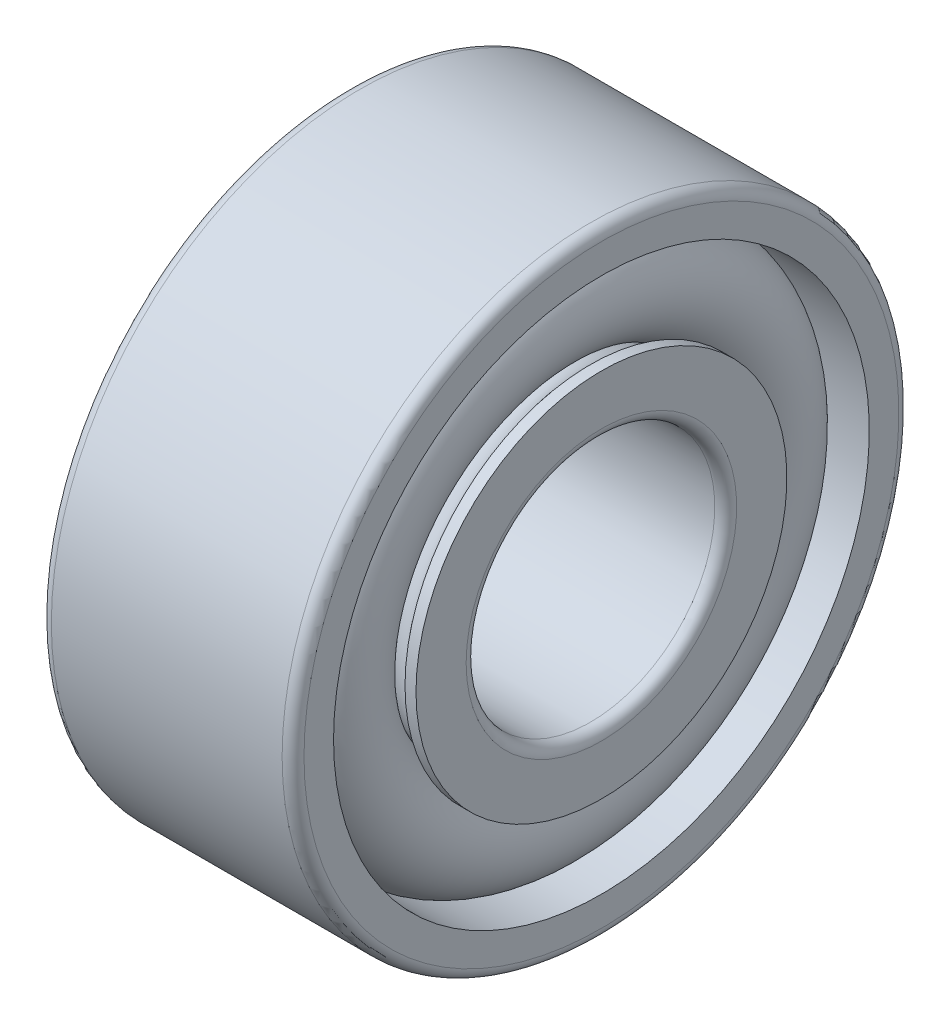
ISO-10303-21;
HEADER;
FILE_DESCRIPTION(('STEP AP214'),'2;1');
FILE_NAME('part.step','',(''),(''),'','','');
FILE_SCHEMA(('AUTOMOTIVE_DESIGN { 1 0 10303 214 1 1 1 1 }'));
ENDSEC;
DATA;
#1=APPLICATION_CONTEXT('core data for automotive mechanical design processes');
#2=APPLICATION_PROTOCOL_DEFINITION('international standard','automotive_design',2000,#1);
#3=PRODUCT_CONTEXT('',#1,'mechanical');
#4=PRODUCT('Part','Part','',(#3));
#5=PRODUCT_RELATED_PRODUCT_CATEGORY('part','',(#4));
#6=PRODUCT_DEFINITION_FORMATION('','',#4);
#7=PRODUCT_DEFINITION_CONTEXT('part definition',#1,'design');
#8=PRODUCT_DEFINITION('design','',#6,#7);
#9=PRODUCT_DEFINITION_SHAPE('','',#8);
#10=(LENGTH_UNIT() NAMED_UNIT(*) SI_UNIT(.MILLI.,.METRE.));
#11=(NAMED_UNIT(*) PLANE_ANGLE_UNIT() SI_UNIT($,.RADIAN.));
#12=(NAMED_UNIT(*) SI_UNIT($,.STERADIAN.) SOLID_ANGLE_UNIT());
#13=UNCERTAINTY_MEASURE_WITH_UNIT(LENGTH_MEASURE(1.E-05),#10,'distance_accuracy_value','');
#14=(GEOMETRIC_REPRESENTATION_CONTEXT(3) GLOBAL_UNCERTAINTY_ASSIGNED_CONTEXT((#13)) GLOBAL_UNIT_ASSIGNED_CONTEXT((#10,
#11,#12)) REPRESENTATION_CONTEXT('',''));
#15=CARTESIAN_POINT('',(0.,0.,0.));
#16=DIRECTION('',(0.,0.,1.));
#17=DIRECTION('',(1.,0.,0.));
#18=AXIS2_PLACEMENT_3D('',#15,#16,#17);
#19=CARTESIAN_POINT('',(19.05,0.,0.));
#20=DIRECTION('',(1.,0.,0.));
#21=DIRECTION('',(0.,-1.,0.));
#22=AXIS2_PLACEMENT_3D('',#19,#20,#21);
#23=TOROIDAL_SURFACE('',#22,21.75,5.18);
#24=CARTESIAN_POINT('',(19.05,-26.93,0.));
#25=VERTEX_POINT('',#24);
#26=VERTEX_LOOP('',#25);
#27=FACE_BOUND('',#26,.T.);
#28=ADVANCED_FACE('P0_F12',(#27),#23,.T.);
#29=CLOSED_SHELL('',(#28));
#30=MANIFOLD_SOLID_BREP('P0_B1',#29);
#31=CARTESIAN_POINT('',(6.35,0.,0.));
#32=DIRECTION('',(1.,0.,0.));
#33=DIRECTION('',(0.,-1.,0.));
#34=AXIS2_PLACEMENT_3D('',#31,#32,#33);
#35=TOROIDAL_SURFACE('',#34,21.75,5.18);
#36=CARTESIAN_POINT('',(6.35,-26.93,0.));
#37=VERTEX_POINT('',#36);
#38=VERTEX_LOOP('',#37);
#39=FACE_BOUND('',#38,.T.);
#40=ADVANCED_FACE('P1_F13',(#39),#35,.T.);
#41=CLOSED_SHELL('',(#40));
#42=MANIFOLD_SOLID_BREP('P1_B1',#41);
#43=CARTESIAN_POINT('',(1.1,0.,0.));
#44=DIRECTION('',(-1.,0.,0.));
#45=DIRECTION('',(0.,0.,1.));
#46=AXIS2_PLACEMENT_3D('',#43,#44,#45);
#47=CYLINDRICAL_SURFACE('',#46,12.5);
#48=CARTESIAN_POINT('',(24.3,0.,0.));
#49=DIRECTION('',(-1.,0.,0.));
#50=DIRECTION('',(0.,0.,1.));
#51=AXIS2_PLACEMENT_3D('',#48,#49,#50);
#52=CIRCLE('',#51,12.5);
#53=CARTESIAN_POINT('',(24.3,0.,12.5));
#54=VERTEX_POINT('',#53);
#55=EDGE_CURVE('P2_E10',#54,#54,#52,.T.);
#56=ORIENTED_EDGE('',*,*,#55,.F.);
#57=EDGE_LOOP('',(#56));
#58=FACE_BOUND('',#57,.T.);
#59=CARTESIAN_POINT('',(1.1,0.,0.));
#60=DIRECTION('',(-1.,0.,0.));
#61=DIRECTION('',(0.,0.,1.));
#62=AXIS2_PLACEMENT_3D('',#59,#60,#61);
#63=CIRCLE('',#62,12.5);
#64=CARTESIAN_POINT('',(1.1,0.,12.5));
#65=VERTEX_POINT('',#64);
#66=EDGE_CURVE('P2_E65',#65,#65,#63,.T.);
#67=ORIENTED_EDGE('',*,*,#66,.T.);
#68=EDGE_LOOP('',(#67));
#69=FACE_BOUND('',#68,.T.);
#70=ADVANCED_FACE('P2_F15',(#58,#69),#47,.F.);
#71=CARTESIAN_POINT('',(24.3,0.,0.));
#72=DIRECTION('',(-1.,0.,0.));
#73=DIRECTION('',(0.,0.,1.));
#74=AXIS2_PLACEMENT_3D('',#71,#72,#73);
#75=TOROIDAL_SURFACE('',#74,13.6,1.1);
#76=CARTESIAN_POINT('',(25.4,0.,0.));
#77=DIRECTION('',(-1.,0.,0.));
#78=DIRECTION('',(0.,0.,1.));
#79=AXIS2_PLACEMENT_3D('',#76,#77,#78);
#80=CIRCLE('',#79,13.6);
#81=CARTESIAN_POINT('',(25.4,0.,13.6));
#82=VERTEX_POINT('',#81);
#83=EDGE_CURVE('P2_E22',#82,#82,#80,.T.);
#84=ORIENTED_EDGE('',*,*,#83,.F.);
#85=EDGE_LOOP('',(#84));
#86=FACE_BOUND('',#85,.T.);
#87=ORIENTED_EDGE('',*,*,#55,.T.);
#88=EDGE_LOOP('',(#87));
#89=FACE_BOUND('',#88,.T.);
#90=ADVANCED_FACE('P2_F91',(#86,#89),#75,.T.);
#91=CARTESIAN_POINT('',(25.4,13.6,0.));
#92=DIRECTION('',(-1.,0.,0.));
#93=DIRECTION('',(0.,0.,1.));
#94=AXIS2_PLACEMENT_3D('',#91,#92,#93);
#95=PLANE('',#94);
#96=CARTESIAN_POINT('',(25.4,0.,0.));
#97=DIRECTION('',(-1.,0.,0.));
#98=DIRECTION('',(0.,0.,1.));
#99=AXIS2_PLACEMENT_3D('',#96,#97,#98);
#100=CIRCLE('',#99,18.642);
#101=CARTESIAN_POINT('',(25.4,0.,18.642));
#102=VERTEX_POINT('',#101);
#103=EDGE_CURVE('P2_E31',#102,#102,#100,.T.);
#104=ORIENTED_EDGE('',*,*,#103,.F.);
#105=EDGE_LOOP('',(#104));
#106=FACE_BOUND('',#105,.T.);
#107=ORIENTED_EDGE('',*,*,#83,.T.);
#108=EDGE_LOOP('',(#107));
#109=FACE_BOUND('',#108,.T.);
#110=ADVANCED_FACE('P2_F97',(#106,#109),#95,.F.);
#111=CARTESIAN_POINT('',(1.1,0.,0.));
#112=DIRECTION('',(-1.,0.,0.));
#113=DIRECTION('',(0.,0.,1.));
#114=AXIS2_PLACEMENT_3D('',#111,#112,#113);
#115=CYLINDRICAL_SURFACE('',#114,18.642);
#116=CARTESIAN_POINT('',(24.294,0.,0.));
#117=DIRECTION('',(-1.,0.,0.));
#118=DIRECTION('',(0.,0.,1.));
#119=AXIS2_PLACEMENT_3D('',#116,#117,#118);
#120=CIRCLE('',#119,18.642);
#121=CARTESIAN_POINT('',(24.294,0.,18.642));
#122=VERTEX_POINT('',#121);
#123=EDGE_CURVE('P2_E39',#122,#122,#120,.T.);
#124=ORIENTED_EDGE('',*,*,#123,.F.);
#125=EDGE_LOOP('',(#124));
#126=FACE_BOUND('',#125,.T.);
#127=ORIENTED_EDGE('',*,*,#103,.T.);
#128=EDGE_LOOP('',(#127));
#129=FACE_BOUND('',#128,.T.);
#130=ADVANCED_FACE('P2_F103',(#126,#129),#115,.T.);
#131=CARTESIAN_POINT('',(20.15,0.,0.));
#132=DIRECTION('',(-1.,0.,0.));
#133=DIRECTION('',(0.,0.,1.));
#134=AXIS2_PLACEMENT_3D('',#131,#132,#133);
#135=TOROIDAL_SURFACE('',#134,21.75,5.18);
#136=ORIENTED_EDGE('',*,*,#123,.T.);
#137=EDGE_LOOP('',(#136));
#138=FACE_BOUND('',#137,.T.);
#139=CARTESIAN_POINT('',(20.15,0.,0.));
#140=DIRECTION('',(-1.,0.,0.));
#141=DIRECTION('',(0.,0.,1.));
#142=AXIS2_PLACEMENT_3D('',#139,#140,#141);
#143=CIRCLE('',#142,16.57);
#144=CARTESIAN_POINT('',(20.15,0.,16.57));
#145=VERTEX_POINT('',#144);
#146=EDGE_CURVE('P2_E45',#145,#145,#143,.T.);
#147=ORIENTED_EDGE('',*,*,#146,.F.);
#148=EDGE_LOOP('',(#147));
#149=FACE_BOUND('',#148,.T.);
#150=ADVANCED_FACE('P2_F109',(#138,#149),#135,.F.);
#151=CARTESIAN_POINT('',(1.1,0.,0.));
#152=DIRECTION('',(-1.,0.,0.));
#153=DIRECTION('',(0.,0.,1.));
#154=AXIS2_PLACEMENT_3D('',#151,#152,#153);
#155=CYLINDRICAL_SURFACE('',#154,16.57);
#156=CARTESIAN_POINT('',(7.45,0.,0.));
#157=DIRECTION('',(-1.,0.,0.));
#158=DIRECTION('',(0.,0.,1.));
#159=AXIS2_PLACEMENT_3D('',#156,#157,#158);
#160=CIRCLE('',#159,16.57);
#161=CARTESIAN_POINT('',(7.45,0.,16.57));
#162=VERTEX_POINT('',#161);
#163=EDGE_CURVE('P2_E49',#162,#162,#160,.T.);
#164=ORIENTED_EDGE('',*,*,#163,.F.);
#165=EDGE_LOOP('',(#164));
#166=FACE_BOUND('',#165,.T.);
#167=ORIENTED_EDGE('',*,*,#146,.T.);
#168=EDGE_LOOP('',(#167));
#169=FACE_BOUND('',#168,.T.);
#170=ADVANCED_FACE('P2_F113',(#166,#169),#155,.T.);
#171=CARTESIAN_POINT('',(7.45,0.,0.));
#172=DIRECTION('',(-1.,0.,0.));
#173=DIRECTION('',(0.,0.,1.));
#174=AXIS2_PLACEMENT_3D('',#171,#172,#173);
#175=TOROIDAL_SURFACE('',#174,21.75,5.18);
#176=ORIENTED_EDGE('',*,*,#163,.T.);
#177=EDGE_LOOP('',(#176));
#178=FACE_BOUND('',#177,.T.);
#179=CARTESIAN_POINT('',(3.306,0.,0.));
#180=DIRECTION('',(-1.,0.,0.));
#181=DIRECTION('',(0.,0.,1.));
#182=AXIS2_PLACEMENT_3D('',#179,#180,#181);
#183=CIRCLE('',#182,18.642);
#184=CARTESIAN_POINT('',(3.306,0.,18.642));
#185=VERTEX_POINT('',#184);
#186=EDGE_CURVE('P2_E53',#185,#185,#183,.T.);
#187=ORIENTED_EDGE('',*,*,#186,.F.);
#188=EDGE_LOOP('',(#187));
#189=FACE_BOUND('',#188,.T.);
#190=ADVANCED_FACE('P2_F87',(#178,#189),#175,.F.);
#191=CARTESIAN_POINT('',(1.1,0.,0.));
#192=DIRECTION('',(-1.,0.,0.));
#193=DIRECTION('',(0.,0.,1.));
#194=AXIS2_PLACEMENT_3D('',#191,#192,#193);
#195=CYLINDRICAL_SURFACE('',#194,18.642);
#196=ORIENTED_EDGE('',*,*,#186,.T.);
#197=EDGE_LOOP('',(#196));
#198=FACE_BOUND('',#197,.T.);
#199=CARTESIAN_POINT('',(0.,0.,0.));
#200=DIRECTION('',(-1.,0.,0.));
#201=DIRECTION('',(0.,0.,1.));
#202=AXIS2_PLACEMENT_3D('',#199,#200,#201);
#203=CIRCLE('',#202,18.642);
#204=CARTESIAN_POINT('',(0.,0.,18.642));
#205=VERTEX_POINT('',#204);
#206=EDGE_CURVE('P2_E57',#205,#205,#203,.T.);
#207=ORIENTED_EDGE('',*,*,#206,.F.);
#208=EDGE_LOOP('',(#207));
#209=FACE_BOUND('',#208,.T.);
#210=ADVANCED_FACE('P2_F79',(#198,#209),#195,.T.);
#211=CARTESIAN_POINT('',(0.,13.6,0.));
#212=DIRECTION('',(-1.,0.,0.));
#213=DIRECTION('',(0.,0.,1.));
#214=AXIS2_PLACEMENT_3D('',#211,#212,#213);
#215=PLANE('',#214);
#216=ORIENTED_EDGE('',*,*,#206,.T.);
#217=EDGE_LOOP('',(#216));
#218=FACE_BOUND('',#217,.T.);
#219=CARTESIAN_POINT('',(0.,0.,0.));
#220=DIRECTION('',(-1.,0.,0.));
#221=DIRECTION('',(0.,0.,1.));
#222=AXIS2_PLACEMENT_3D('',#219,#220,#221);
#223=CIRCLE('',#222,13.6);
#224=CARTESIAN_POINT('',(0.,0.,13.6));
#225=VERTEX_POINT('',#224);
#226=EDGE_CURVE('P2_E61',#225,#225,#223,.T.);
#227=ORIENTED_EDGE('',*,*,#226,.F.);
#228=EDGE_LOOP('',(#227));
#229=FACE_BOUND('',#228,.T.);
#230=ADVANCED_FACE('P2_F74',(#218,#229),#215,.T.);
#231=CARTESIAN_POINT('',(1.1,0.,0.));
#232=DIRECTION('',(-1.,0.,0.));
#233=DIRECTION('',(0.,0.,1.));
#234=AXIS2_PLACEMENT_3D('',#231,#232,#233);
#235=TOROIDAL_SURFACE('',#234,13.6,1.1);
#236=ORIENTED_EDGE('',*,*,#66,.F.);
#237=EDGE_LOOP('',(#236));
#238=FACE_BOUND('',#237,.T.);
#239=ORIENTED_EDGE('',*,*,#226,.T.);
#240=EDGE_LOOP('',(#239));
#241=FACE_BOUND('',#240,.T.);
#242=ADVANCED_FACE('P2_F71',(#238,#241),#235,.T.);
#243=CLOSED_SHELL('',(#70,#90,#110,#130,#150,#170,#190,#210,#230,#242));
#244=MANIFOLD_SOLID_BREP('P2_B1',#243);
#245=CARTESIAN_POINT('',(0.,0.,0.));
#246=DIRECTION('',(-1.,0.,0.));
#247=DIRECTION('',(0.,0.,1.));
#248=AXIS2_PLACEMENT_3D('',#245,#246,#247);
#249=CYLINDRICAL_SURFACE('',#248,31.);
#250=CARTESIAN_POINT('',(1.1,0.,0.));
#251=DIRECTION('',(-1.,0.,0.));
#252=DIRECTION('',(0.,0.,1.));
#253=AXIS2_PLACEMENT_3D('',#250,#251,#252);
#254=CIRCLE('',#253,31.);
#255=CARTESIAN_POINT('',(1.1,0.,31.));
#256=VERTEX_POINT('',#255);
#257=EDGE_CURVE('P3_E10',#256,#256,#254,.T.);
#258=ORIENTED_EDGE('',*,*,#257,.F.);
#259=EDGE_LOOP('',(#258));
#260=FACE_BOUND('',#259,.T.);
#261=CARTESIAN_POINT('',(24.3,0.,0.));
#262=DIRECTION('',(-1.,0.,0.));
#263=DIRECTION('',(0.,0.,1.));
#264=AXIS2_PLACEMENT_3D('',#261,#262,#263);
#265=CIRCLE('',#264,31.);
#266=CARTESIAN_POINT('',(24.3,0.,31.));
#267=VERTEX_POINT('',#266);
#268=EDGE_CURVE('P3_E65',#267,#267,#265,.T.);
#269=ORIENTED_EDGE('',*,*,#268,.T.);
#270=EDGE_LOOP('',(#269));
#271=FACE_BOUND('',#270,.T.);
#272=ADVANCED_FACE('P3_F15',(#260,#271),#249,.T.);
#273=CARTESIAN_POINT('',(1.1,0.,0.));
#274=DIRECTION('',(-1.,0.,0.));
#275=DIRECTION('',(0.,0.,1.));
#276=AXIS2_PLACEMENT_3D('',#273,#274,#275);
#277=TOROIDAL_SURFACE('',#276,29.9,1.1);
#278=CARTESIAN_POINT('',(0.,0.,0.));
#279=DIRECTION('',(-1.,0.,0.));
#280=DIRECTION('',(0.,0.,1.));
#281=AXIS2_PLACEMENT_3D('',#278,#279,#280);
#282=CIRCLE('',#281,29.9);
#283=CARTESIAN_POINT('',(0.,0.,29.9));
#284=VERTEX_POINT('',#283);
#285=EDGE_CURVE('P3_E22',#284,#284,#282,.T.);
#286=ORIENTED_EDGE('',*,*,#285,.F.);
#287=EDGE_LOOP('',(#286));
#288=FACE_BOUND('',#287,.T.);
#289=ORIENTED_EDGE('',*,*,#257,.T.);
#290=EDGE_LOOP('',(#289));
#291=FACE_BOUND('',#290,.T.);
#292=ADVANCED_FACE('P3_F97',(#288,#291),#277,.T.);
#293=CARTESIAN_POINT('',(0.,26.93,0.));
#294=DIRECTION('',(-1.,0.,0.));
#295=DIRECTION('',(0.,0.,1.));
#296=AXIS2_PLACEMENT_3D('',#293,#294,#295);
#297=PLANE('',#296);
#298=ORIENTED_EDGE('',*,*,#285,.T.);
#299=EDGE_LOOP('',(#298));
#300=FACE_BOUND('',#299,.T.);
#301=CARTESIAN_POINT('',(0.,0.,0.));
#302=DIRECTION('',(-1.,0.,0.));
#303=DIRECTION('',(0.,0.,1.));
#304=AXIS2_PLACEMENT_3D('',#301,#302,#303);
#305=CIRCLE('',#304,26.93);
#306=CARTESIAN_POINT('',(0.,0.,26.93));
#307=VERTEX_POINT('',#306);
#308=EDGE_CURVE('P3_E31',#307,#307,#305,.T.);
#309=ORIENTED_EDGE('',*,*,#308,.F.);
#310=EDGE_LOOP('',(#309));
#311=FACE_BOUND('',#310,.T.);
#312=ADVANCED_FACE('P3_F103',(#300,#311),#297,.T.);
#313=CARTESIAN_POINT('',(0.,0.,0.));
#314=DIRECTION('',(-1.,0.,0.));
#315=DIRECTION('',(0.,0.,1.));
#316=AXIS2_PLACEMENT_3D('',#313,#314,#315);
#317=CYLINDRICAL_SURFACE('',#316,26.93);
#318=CARTESIAN_POINT('',(6.35,0.,0.));
#319=DIRECTION('',(-1.,0.,0.));
#320=DIRECTION('',(0.,0.,1.));
#321=AXIS2_PLACEMENT_3D('',#318,#319,#320);
#322=CIRCLE('',#321,26.93);
#323=CARTESIAN_POINT('',(6.35,0.,26.93));
#324=VERTEX_POINT('',#323);
#325=EDGE_CURVE('P3_E39',#324,#324,#322,.T.);
#326=ORIENTED_EDGE('',*,*,#325,.F.);
#327=EDGE_LOOP('',(#326));
#328=FACE_BOUND('',#327,.T.);
#329=ORIENTED_EDGE('',*,*,#308,.T.);
#330=EDGE_LOOP('',(#329));
#331=FACE_BOUND('',#330,.T.);
#332=ADVANCED_FACE('P3_F109',(#328,#331),#317,.F.);
#333=CARTESIAN_POINT('',(6.35,0.,0.));
#334=DIRECTION('',(-1.,0.,0.));
#335=DIRECTION('',(0.,0.,1.));
#336=AXIS2_PLACEMENT_3D('',#333,#334,#335);
#337=TOROIDAL_SURFACE('',#336,21.75,5.18);
#338=ORIENTED_EDGE('',*,*,#325,.T.);
#339=EDGE_LOOP('',(#338));
#340=FACE_BOUND('',#339,.T.);
#341=CARTESIAN_POINT('',(10.494,0.,0.));
#342=DIRECTION('',(-1.,0.,0.));
#343=DIRECTION('',(0.,0.,1.));
#344=AXIS2_PLACEMENT_3D('',#341,#342,#343);
#345=CIRCLE('',#344,24.858);
#346=CARTESIAN_POINT('',(10.494,0.,24.858));
#347=VERTEX_POINT('',#346);
#348=EDGE_CURVE('P3_E45',#347,#347,#345,.T.);
#349=ORIENTED_EDGE('',*,*,#348,.F.);
#350=EDGE_LOOP('',(#349));
#351=FACE_BOUND('',#350,.T.);
#352=ADVANCED_FACE('P3_F114',(#340,#351),#337,.F.);
#353=CARTESIAN_POINT('',(0.,0.,0.));
#354=DIRECTION('',(-1.,0.,0.));
#355=DIRECTION('',(0.,0.,1.));
#356=AXIS2_PLACEMENT_3D('',#353,#354,#355);
#357=CYLINDRICAL_SURFACE('',#356,24.858);
#358=ORIENTED_EDGE('',*,*,#348,.T.);
#359=EDGE_LOOP('',(#358));
#360=FACE_BOUND('',#359,.T.);
#361=CARTESIAN_POINT('',(14.906,0.,0.));
#362=DIRECTION('',(-1.,0.,0.));
#363=DIRECTION('',(0.,0.,1.));
#364=AXIS2_PLACEMENT_3D('',#361,#362,#363);
#365=CIRCLE('',#364,24.858);
#366=CARTESIAN_POINT('',(14.906,0.,24.858));
#367=VERTEX_POINT('',#366);
#368=EDGE_CURVE('P3_E49',#367,#367,#365,.T.);
#369=ORIENTED_EDGE('',*,*,#368,.F.);
#370=EDGE_LOOP('',(#369));
#371=FACE_BOUND('',#370,.T.);
#372=ADVANCED_FACE('P3_F93',(#360,#371),#357,.F.);
#373=CARTESIAN_POINT('',(19.05,0.,0.));
#374=DIRECTION('',(-1.,0.,0.));
#375=DIRECTION('',(0.,0.,1.));
#376=AXIS2_PLACEMENT_3D('',#373,#374,#375);
#377=TOROIDAL_SURFACE('',#376,21.75,5.18);
#378=ORIENTED_EDGE('',*,*,#368,.T.);
#379=EDGE_LOOP('',(#378));
#380=FACE_BOUND('',#379,.T.);
#381=CARTESIAN_POINT('',(19.05,0.,0.));
#382=DIRECTION('',(-1.,0.,0.));
#383=DIRECTION('',(0.,0.,1.));
#384=AXIS2_PLACEMENT_3D('',#381,#382,#383);
#385=CIRCLE('',#384,26.93);
#386=CARTESIAN_POINT('',(19.05,0.,26.93));
#387=VERTEX_POINT('',#386);
#388=EDGE_CURVE('P3_E53',#387,#387,#385,.T.);
#389=ORIENTED_EDGE('',*,*,#388,.F.);
#390=EDGE_LOOP('',(#389));
#391=FACE_BOUND('',#390,.T.);
#392=ADVANCED_FACE('P3_F85',(#380,#391),#377,.F.);
#393=CARTESIAN_POINT('',(0.,0.,0.));
#394=DIRECTION('',(-1.,0.,0.));
#395=DIRECTION('',(0.,0.,1.));
#396=AXIS2_PLACEMENT_3D('',#393,#394,#395);
#397=CYLINDRICAL_SURFACE('',#396,26.93);
#398=ORIENTED_EDGE('',*,*,#388,.T.);
#399=EDGE_LOOP('',(#398));
#400=FACE_BOUND('',#399,.T.);
#401=CARTESIAN_POINT('',(25.4,0.,0.));
#402=DIRECTION('',(-1.,0.,0.));
#403=DIRECTION('',(0.,0.,1.));
#404=AXIS2_PLACEMENT_3D('',#401,#402,#403);
#405=CIRCLE('',#404,26.93);
#406=CARTESIAN_POINT('',(25.4,0.,26.93));
#407=VERTEX_POINT('',#406);
#408=EDGE_CURVE('P3_E57',#407,#407,#405,.T.);
#409=ORIENTED_EDGE('',*,*,#408,.F.);
#410=EDGE_LOOP('',(#409));
#411=FACE_BOUND('',#410,.T.);
#412=ADVANCED_FACE('P3_F80',(#400,#411),#397,.F.);
#413=CARTESIAN_POINT('',(25.4,26.93,0.));
#414=DIRECTION('',(-1.,0.,0.));
#415=DIRECTION('',(0.,0.,1.));
#416=AXIS2_PLACEMENT_3D('',#413,#414,#415);
#417=PLANE('',#416);
#418=CARTESIAN_POINT('',(25.4,0.,0.));
#419=DIRECTION('',(-1.,0.,0.));
#420=DIRECTION('',(0.,0.,1.));
#421=AXIS2_PLACEMENT_3D('',#418,#419,#420);
#422=CIRCLE('',#421,29.9);
#423=CARTESIAN_POINT('',(25.4,0.,29.9));
#424=VERTEX_POINT('',#423);
#425=EDGE_CURVE('P3_E61',#424,#424,#422,.T.);
#426=ORIENTED_EDGE('',*,*,#425,.F.);
#427=EDGE_LOOP('',(#426));
#428=FACE_BOUND('',#427,.T.);
#429=ORIENTED_EDGE('',*,*,#408,.T.);
#430=EDGE_LOOP('',(#429));
#431=FACE_BOUND('',#430,.T.);
#432=ADVANCED_FACE('P3_F74',(#428,#431),#417,.F.);
#433=CARTESIAN_POINT('',(24.3,0.,0.));
#434=DIRECTION('',(-1.,0.,0.));
#435=DIRECTION('',(0.,0.,1.));
#436=AXIS2_PLACEMENT_3D('',#433,#434,#435);
#437=TOROIDAL_SURFACE('',#436,29.9,1.1);
#438=ORIENTED_EDGE('',*,*,#268,.F.);
#439=EDGE_LOOP('',(#438));
#440=FACE_BOUND('',#439,.T.);
#441=ORIENTED_EDGE('',*,*,#425,.T.);
#442=EDGE_LOOP('',(#441));
#443=FACE_BOUND('',#442,.T.);
#444=ADVANCED_FACE('P3_F71',(#440,#443),#437,.T.);
#445=CLOSED_SHELL('',(#272,#292,#312,#332,#352,#372,#392,#412,#432,#444));
#446=MANIFOLD_SOLID_BREP('P3_B1',#445);
#447=ADVANCED_BREP_SHAPE_REPRESENTATION('',(#18,#30,#42,#244,#446),#14);
#448=SHAPE_DEFINITION_REPRESENTATION(#9,#447);
ENDSEC;
END-ISO-10303-21;
